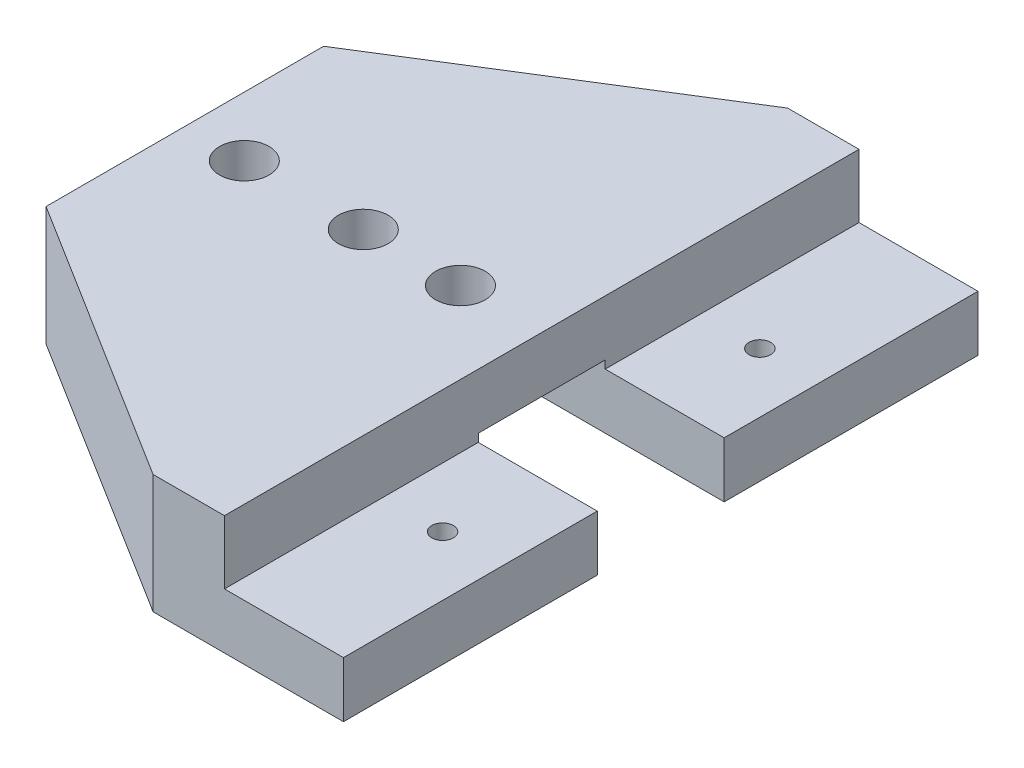
ISO-10303-21;
HEADER;
FILE_DESCRIPTION(('STEP AP214'),'2;1');
FILE_NAME('part.step','',(''),(''),'','','');
FILE_SCHEMA(('AUTOMOTIVE_DESIGN { 1 0 10303 214 1 1 1 1 }'));
ENDSEC;
DATA;
#1=APPLICATION_CONTEXT('core data for automotive mechanical design processes');
#2=APPLICATION_PROTOCOL_DEFINITION('international standard','automotive_design',2000,#1);
#3=PRODUCT_CONTEXT('',#1,'mechanical');
#4=PRODUCT('Part','Part','',(#3));
#5=PRODUCT_RELATED_PRODUCT_CATEGORY('part','',(#4));
#6=PRODUCT_DEFINITION_FORMATION('','',#4);
#7=PRODUCT_DEFINITION_CONTEXT('part definition',#1,'design');
#8=PRODUCT_DEFINITION('design','',#6,#7);
#9=PRODUCT_DEFINITION_SHAPE('','',#8);
#10=(LENGTH_UNIT() NAMED_UNIT(*) SI_UNIT(.MILLI.,.METRE.));
#11=(NAMED_UNIT(*) PLANE_ANGLE_UNIT() SI_UNIT($,.RADIAN.));
#12=(NAMED_UNIT(*) SI_UNIT($,.STERADIAN.) SOLID_ANGLE_UNIT());
#13=UNCERTAINTY_MEASURE_WITH_UNIT(LENGTH_MEASURE(1.E-05),#10,'distance_accuracy_value','');
#14=(GEOMETRIC_REPRESENTATION_CONTEXT(3) GLOBAL_UNCERTAINTY_ASSIGNED_CONTEXT((#13)) GLOBAL_UNIT_ASSIGNED_CONTEXT((#10,
#11,#12)) REPRESENTATION_CONTEXT('',''));
#15=CARTESIAN_POINT('',(0.,0.,0.));
#16=DIRECTION('',(0.,0.,1.));
#17=DIRECTION('',(1.,0.,0.));
#18=AXIS2_PLACEMENT_3D('',#15,#16,#17);
#19=CARTESIAN_POINT('',(-15.24,9.525,50.8));
#20=DIRECTION('',(0.,0.,-1.));
#21=DIRECTION('',(-1.,0.,0.));
#22=AXIS2_PLACEMENT_3D('',#19,#20,#21);
#23=PLANE('',#22);
#24=DIRECTION('',(0.,1.,0.));
#25=VECTOR('',#24,1.);
#26=CARTESIAN_POINT('',(-3.81,-0.635,50.8));
#27=LINE('',#26,#25);
#28=CARTESIAN_POINT('',(-3.81,-0.635,50.8));
#29=VERTEX_POINT('',#28);
#30=CARTESIAN_POINT('',(-3.81,9.525,50.8));
#31=VERTEX_POINT('',#30);
#32=EDGE_CURVE('E158',#29,#31,#27,.T.);
#33=ORIENTED_EDGE('',*,*,#32,.T.);
#34=DIRECTION('',(1.,0.,0.));
#35=VECTOR('',#34,1.);
#36=CARTESIAN_POINT('',(-15.24,9.525,50.8));
#37=LINE('',#36,#35);
#38=CARTESIAN_POINT('',(-15.24,9.525,50.8));
#39=VERTEX_POINT('',#38);
#40=EDGE_CURVE('E227',#39,#31,#37,.T.);
#41=ORIENTED_EDGE('',*,*,#40,.F.);
#42=DIRECTION('',(0.,-1.,0.));
#43=VECTOR('',#42,1.);
#44=CARTESIAN_POINT('',(-15.24,9.525,50.8));
#45=LINE('',#44,#43);
#46=CARTESIAN_POINT('',(-15.24,-9.525,50.8));
#47=VERTEX_POINT('',#46);
#48=EDGE_CURVE('E243',#39,#47,#45,.T.);
#49=ORIENTED_EDGE('',*,*,#48,.T.);
#50=DIRECTION('',(1.,0.,0.));
#51=VECTOR('',#50,1.);
#52=CARTESIAN_POINT('',(-15.24,-9.525,50.8));
#53=LINE('',#52,#51);
#54=CARTESIAN_POINT('',(15.24,-9.525,50.8));
#55=VERTEX_POINT('',#54);
#56=EDGE_CURVE('E218',#47,#55,#53,.T.);
#57=ORIENTED_EDGE('',*,*,#56,.T.);
#58=DIRECTION('',(0.,-1.,0.));
#59=VECTOR('',#58,1.);
#60=CARTESIAN_POINT('',(15.24,9.525,50.8));
#61=LINE('',#60,#59);
#62=CARTESIAN_POINT('',(15.24,-0.635,50.8));
#63=VERTEX_POINT('',#62);
#64=EDGE_CURVE('E171',#63,#55,#61,.T.);
#65=ORIENTED_EDGE('',*,*,#64,.F.);
#66=DIRECTION('',(-1.,0.,0.));
#67=VECTOR('',#66,1.);
#68=CARTESIAN_POINT('',(15.24,-0.635,50.8));
#69=LINE('',#68,#67);
#70=EDGE_CURVE('E149',#63,#29,#69,.T.);
#71=ORIENTED_EDGE('',*,*,#70,.T.);
#72=EDGE_LOOP('',(#33,#41,#49,#57,#65,#71));
#73=FACE_BOUND('',#72,.T.);
#74=ADVANCED_FACE('F42',(#73),#23,.F.);
#75=CARTESIAN_POINT('',(15.24,9.525,50.8));
#76=DIRECTION('',(-1.,0.,0.));
#77=DIRECTION('',(0.,0.,1.));
#78=AXIS2_PLACEMENT_3D('',#75,#76,#77);
#79=PLANE('',#78);
#80=DIRECTION('',(0.,-1.,0.));
#81=VECTOR('',#80,1.);
#82=CARTESIAN_POINT('',(15.24,9.525,-50.8));
#83=LINE('',#82,#81);
#84=CARTESIAN_POINT('',(15.24,-0.635,-50.8));
#85=VERTEX_POINT('',#84);
#86=CARTESIAN_POINT('',(15.24,-9.525,-50.8));
#87=VERTEX_POINT('',#86);
#88=EDGE_CURVE('E279',#85,#87,#83,.T.);
#89=ORIENTED_EDGE('',*,*,#88,.F.);
#90=DIRECTION('',(0.,0.,-1.));
#91=VECTOR('',#90,1.);
#92=CARTESIAN_POINT('',(15.24,-0.635,50.8));
#93=LINE('',#92,#91);
#94=CARTESIAN_POINT('',(15.24,-0.635,-10.16));
#95=VERTEX_POINT('',#94);
#96=EDGE_CURVE('E185',#95,#85,#93,.T.);
#97=ORIENTED_EDGE('',*,*,#96,.F.);
#98=DIRECTION('',(0.,-1.,0.));
#99=VECTOR('',#98,1.);
#100=CARTESIAN_POINT('',(15.24,0.635,-10.16));
#101=LINE('',#100,#99);
#102=CARTESIAN_POINT('',(15.24,-9.525,-10.16));
#103=VERTEX_POINT('',#102);
#104=EDGE_CURVE('E222',#95,#103,#101,.T.);
#105=ORIENTED_EDGE('',*,*,#104,.T.);
#106=DIRECTION('',(0.,0.,-1.));
#107=VECTOR('',#106,1.);
#108=CARTESIAN_POINT('',(15.24,-9.525,50.8));
#109=LINE('',#108,#107);
#110=EDGE_CURVE('E246',#103,#87,#109,.T.);
#111=ORIENTED_EDGE('',*,*,#110,.T.);
#112=EDGE_LOOP('',(#89,#97,#105,#111));
#113=FACE_BOUND('',#112,.T.);
#114=ADVANCED_FACE('F358',(#113),#79,.F.);
#115=CARTESIAN_POINT('',(15.24,9.525,-50.8));
#116=DIRECTION('',(0.,0.,1.));
#117=DIRECTION('',(1.,0.,0.));
#118=AXIS2_PLACEMENT_3D('',#115,#116,#117);
#119=PLANE('',#118);
#120=DIRECTION('',(0.,1.,0.));
#121=VECTOR('',#120,1.);
#122=CARTESIAN_POINT('',(-3.81,-0.635,-50.8));
#123=LINE('',#122,#121);
#124=CARTESIAN_POINT('',(-3.81,-0.635,-50.8));
#125=VERTEX_POINT('',#124);
#126=CARTESIAN_POINT('',(-3.81,9.525,-50.8));
#127=VERTEX_POINT('',#126);
#128=EDGE_CURVE('E167',#125,#127,#123,.T.);
#129=ORIENTED_EDGE('',*,*,#128,.F.);
#130=DIRECTION('',(-1.,0.,0.));
#131=VECTOR('',#130,1.);
#132=CARTESIAN_POINT('',(15.24,-0.635,-50.8));
#133=LINE('',#132,#131);
#134=EDGE_CURVE('E154',#85,#125,#133,.T.);
#135=ORIENTED_EDGE('',*,*,#134,.F.);
#136=ORIENTED_EDGE('',*,*,#88,.T.);
#137=DIRECTION('',(-1.,0.,0.));
#138=VECTOR('',#137,1.);
#139=CARTESIAN_POINT('',(15.24,-9.525,-50.8));
#140=LINE('',#139,#138);
#141=CARTESIAN_POINT('',(-15.24,-9.525,-50.8));
#142=VERTEX_POINT('',#141);
#143=EDGE_CURVE('E251',#87,#142,#140,.T.);
#144=ORIENTED_EDGE('',*,*,#143,.T.);
#145=DIRECTION('',(0.,-1.,0.));
#146=VECTOR('',#145,1.);
#147=CARTESIAN_POINT('',(-15.24,9.525,-50.8));
#148=LINE('',#147,#146);
#149=CARTESIAN_POINT('',(-15.24,9.525,-50.8));
#150=VERTEX_POINT('',#149);
#151=EDGE_CURVE('E275',#150,#142,#148,.T.);
#152=ORIENTED_EDGE('',*,*,#151,.F.);
#153=DIRECTION('',(-1.,0.,0.));
#154=VECTOR('',#153,1.);
#155=CARTESIAN_POINT('',(15.24,9.525,-50.8));
#156=LINE('',#155,#154);
#157=EDGE_CURVE('E230',#127,#150,#156,.T.);
#158=ORIENTED_EDGE('',*,*,#157,.F.);
#159=EDGE_LOOP('',(#129,#135,#136,#144,#152,#158));
#160=FACE_BOUND('',#159,.T.);
#161=ADVANCED_FACE('F325',(#160),#119,.F.);
#162=CARTESIAN_POINT('',(0.,9.525,0.));
#163=DIRECTION('',(0.,1.,0.));
#164=DIRECTION('',(0.,0.,1.));
#165=AXIS2_PLACEMENT_3D('',#162,#163,#164);
#166=PLANE('',#165);
#167=CARTESIAN_POINT('',(-51.435,9.525,0.));
#168=DIRECTION('',(0.,1.,0.));
#169=DIRECTION('',(0.,0.,1.));
#170=AXIS2_PLACEMENT_3D('',#167,#168,#169);
#171=CIRCLE('',#170,3.96875);
#172=CARTESIAN_POINT('',(-51.435,9.525,3.96875));
#173=VERTEX_POINT('',#172);
#174=EDGE_CURVE('E292',#173,#173,#171,.T.);
#175=ORIENTED_EDGE('',*,*,#174,.F.);
#176=EDGE_LOOP('',(#175));
#177=FACE_BOUND('',#176,.T.);
#178=CARTESIAN_POINT('',(-32.385,9.525,0.));
#179=DIRECTION('',(0.,1.,0.));
#180=DIRECTION('',(0.,0.,1.));
#181=AXIS2_PLACEMENT_3D('',#178,#179,#180);
#182=CIRCLE('',#181,3.96875);
#183=CARTESIAN_POINT('',(-32.385,9.525,3.96875));
#184=VERTEX_POINT('',#183);
#185=EDGE_CURVE('E291',#184,#184,#182,.T.);
#186=ORIENTED_EDGE('',*,*,#185,.F.);
#187=EDGE_LOOP('',(#186));
#188=FACE_BOUND('',#187,.T.);
#189=CARTESIAN_POINT('',(-16.8275,9.525,0.));
#190=DIRECTION('',(0.,1.,0.));
#191=DIRECTION('',(0.,0.,1.));
#192=AXIS2_PLACEMENT_3D('',#189,#190,#191);
#193=CIRCLE('',#192,3.96875);
#194=CARTESIAN_POINT('',(-16.8275,9.525,3.96875));
#195=VERTEX_POINT('',#194);
#196=EDGE_CURVE('E179',#195,#195,#193,.T.);
#197=ORIENTED_EDGE('',*,*,#196,.F.);
#198=EDGE_LOOP('',(#197));
#199=FACE_BOUND('',#198,.T.);
#200=ORIENTED_EDGE('',*,*,#40,.T.);
#201=DIRECTION('',(0.,0.,-1.));
#202=VECTOR('',#201,1.);
#203=CARTESIAN_POINT('',(-3.81,9.525,50.8));
#204=LINE('',#203,#202);
#205=EDGE_CURVE('E161',#31,#127,#204,.T.);
#206=ORIENTED_EDGE('',*,*,#205,.T.);
#207=ORIENTED_EDGE('',*,*,#157,.T.);
#208=DIRECTION('',(-0.847998304005088,0.,0.52999894000318));
#209=VECTOR('',#208,1.);
#210=CARTESIAN_POINT('',(-15.24,9.525,-50.8));
#211=LINE('',#210,#209);
#212=CARTESIAN_POINT('',(-60.96,9.525,-22.225));
#213=VERTEX_POINT('',#212);
#214=EDGE_CURVE('E234',#150,#213,#211,.T.);
#215=ORIENTED_EDGE('',*,*,#214,.T.);
#216=DIRECTION('',(0.,0.,1.));
#217=VECTOR('',#216,1.);
#218=CARTESIAN_POINT('',(-60.96,9.525,-22.225));
#219=LINE('',#218,#217);
#220=CARTESIAN_POINT('',(-60.96,9.525,22.225));
#221=VERTEX_POINT('',#220);
#222=EDGE_CURVE('E237',#213,#221,#219,.T.);
#223=ORIENTED_EDGE('',*,*,#222,.T.);
#224=DIRECTION('',(0.847998304005088,0.,0.52999894000318));
#225=VECTOR('',#224,1.);
#226=CARTESIAN_POINT('',(-60.96,9.525,22.225));
#227=LINE('',#226,#225);
#228=EDGE_CURVE('E240',#221,#39,#227,.T.);
#229=ORIENTED_EDGE('',*,*,#228,.T.);
#230=EDGE_LOOP('',(#200,#206,#207,#215,#223,#229));
#231=FACE_BOUND('',#230,.T.);
#232=ADVANCED_FACE('F321',(#177,#188,#199,#231),#166,.T.);
#233=CARTESIAN_POINT('',(-60.96,0.635,10.16));
#234=DIRECTION('',(0.,0.,1.));
#235=DIRECTION('',(1.,0.,0.));
#236=AXIS2_PLACEMENT_3D('',#233,#234,#235);
#237=PLANE('',#236);
#238=DIRECTION('',(0.,1.,0.));
#239=VECTOR('',#238,1.);
#240=CARTESIAN_POINT('',(-3.81,0.635,10.16));
#241=LINE('',#240,#239);
#242=CARTESIAN_POINT('',(-3.81,-0.635,10.16));
#243=VERTEX_POINT('',#242);
#244=CARTESIAN_POINT('',(-3.81000000000001,0.635,10.16));
#245=VERTEX_POINT('',#244);
#246=EDGE_CURVE('E59',#243,#245,#241,.T.);
#247=ORIENTED_EDGE('',*,*,#246,.F.);
#248=DIRECTION('',(1.,0.,0.));
#249=VECTOR('',#248,1.);
#250=CARTESIAN_POINT('',(-60.96,-0.635,10.16));
#251=LINE('',#250,#249);
#252=CARTESIAN_POINT('',(15.24,-0.635,10.16));
#253=VERTEX_POINT('',#252);
#254=EDGE_CURVE('E152',#243,#253,#251,.T.);
#255=ORIENTED_EDGE('',*,*,#254,.T.);
#256=DIRECTION('',(0.,-1.,0.));
#257=VECTOR('',#256,1.);
#258=CARTESIAN_POINT('',(15.24,0.635,10.16));
#259=LINE('',#258,#257);
#260=CARTESIAN_POINT('',(15.24,-9.525,10.16));
#261=VERTEX_POINT('',#260);
#262=EDGE_CURVE('E219',#253,#261,#259,.T.);
#263=ORIENTED_EDGE('',*,*,#262,.T.);
#264=DIRECTION('',(-1.,0.,0.));
#265=VECTOR('',#264,1.);
#266=CARTESIAN_POINT('',(-60.96,-9.525,10.16));
#267=LINE('',#266,#265);
#268=CARTESIAN_POINT('',(-60.96,-9.525,10.16));
#269=VERTEX_POINT('',#268);
#270=EDGE_CURVE('E203',#261,#269,#267,.T.);
#271=ORIENTED_EDGE('',*,*,#270,.T.);
#272=DIRECTION('',(0.,-1.,0.));
#273=VECTOR('',#272,1.);
#274=CARTESIAN_POINT('',(-60.96,0.635,10.16));
#275=LINE('',#274,#273);
#276=CARTESIAN_POINT('',(-60.96,0.635,10.16));
#277=VERTEX_POINT('',#276);
#278=EDGE_CURVE('E214',#277,#269,#275,.T.);
#279=ORIENTED_EDGE('',*,*,#278,.F.);
#280=DIRECTION('',(-1.,0.,0.));
#281=VECTOR('',#280,1.);
#282=CARTESIAN_POINT('',(-60.96,0.635,10.16));
#283=LINE('',#282,#281);
#284=EDGE_CURVE('E207',#245,#277,#283,.T.);
#285=ORIENTED_EDGE('',*,*,#284,.F.);
#286=EDGE_LOOP('',(#247,#255,#263,#271,#279,#285));
#287=FACE_BOUND('',#286,.T.);
#288=ADVANCED_FACE('F324',(#287),#237,.F.);
#289=CARTESIAN_POINT('',(-60.96,0.635,-10.16));
#290=DIRECTION('',(0.,0.,-1.));
#291=DIRECTION('',(-1.,0.,0.));
#292=AXIS2_PLACEMENT_3D('',#289,#290,#291);
#293=PLANE('',#292);
#294=DIRECTION('',(0.,-1.,0.));
#295=VECTOR('',#294,1.);
#296=CARTESIAN_POINT('',(-3.81,0.635,-10.16));
#297=LINE('',#296,#295);
#298=CARTESIAN_POINT('',(-3.81,0.635,-10.16));
#299=VERTEX_POINT('',#298);
#300=CARTESIAN_POINT('',(-3.81,-0.635,-10.16));
#301=VERTEX_POINT('',#300);
#302=EDGE_CURVE('E166',#299,#301,#297,.T.);
#303=ORIENTED_EDGE('',*,*,#302,.F.);
#304=DIRECTION('',(1.,0.,0.));
#305=VECTOR('',#304,1.);
#306=CARTESIAN_POINT('',(-60.96,0.635,-10.16));
#307=LINE('',#306,#305);
#308=CARTESIAN_POINT('',(-60.96,0.635,-10.16));
#309=VERTEX_POINT('',#308);
#310=EDGE_CURVE('E202',#309,#299,#307,.T.);
#311=ORIENTED_EDGE('',*,*,#310,.F.);
#312=DIRECTION('',(0.,-1.,0.));
#313=VECTOR('',#312,1.);
#314=CARTESIAN_POINT('',(-60.96,0.635,-10.16));
#315=LINE('',#314,#313);
#316=CARTESIAN_POINT('',(-60.96,-9.525,-10.16));
#317=VERTEX_POINT('',#316);
#318=EDGE_CURVE('E67',#309,#317,#315,.T.);
#319=ORIENTED_EDGE('',*,*,#318,.T.);
#320=DIRECTION('',(1.,0.,0.));
#321=VECTOR('',#320,1.);
#322=CARTESIAN_POINT('',(-60.96,-9.525,-10.16));
#323=LINE('',#322,#321);
#324=EDGE_CURVE('E197',#317,#103,#323,.T.);
#325=ORIENTED_EDGE('',*,*,#324,.T.);
#326=ORIENTED_EDGE('',*,*,#104,.F.);
#327=DIRECTION('',(-1.,0.,0.));
#328=VECTOR('',#327,1.);
#329=CARTESIAN_POINT('',(-60.96,-0.635,-10.16));
#330=LINE('',#329,#328);
#331=EDGE_CURVE('E11',#95,#301,#330,.T.);
#332=ORIENTED_EDGE('',*,*,#331,.T.);
#333=EDGE_LOOP('',(#303,#311,#319,#325,#326,#332));
#334=FACE_BOUND('',#333,.T.);
#335=ADVANCED_FACE('F350',(#334),#293,.F.);
#336=CARTESIAN_POINT('',(0.,0.635,0.));
#337=DIRECTION('',(0.,1.,0.));
#338=DIRECTION('',(0.,0.,1.));
#339=AXIS2_PLACEMENT_3D('',#336,#337,#338);
#340=PLANE('',#339);
#341=CARTESIAN_POINT('',(-51.435,0.635,0.));
#342=DIRECTION('',(0.,1.,0.));
#343=DIRECTION('',(0.,0.,1.));
#344=AXIS2_PLACEMENT_3D('',#341,#342,#343);
#345=CIRCLE('',#344,3.96875);
#346=CARTESIAN_POINT('',(-51.435,0.635,3.96875));
#347=VERTEX_POINT('',#346);
#348=EDGE_CURVE('E288',#347,#347,#345,.T.);
#349=ORIENTED_EDGE('',*,*,#348,.T.);
#350=EDGE_LOOP('',(#349));
#351=FACE_BOUND('',#350,.T.);
#352=CARTESIAN_POINT('',(-32.385,0.635,0.));
#353=DIRECTION('',(0.,1.,0.));
#354=DIRECTION('',(0.,0.,1.));
#355=AXIS2_PLACEMENT_3D('',#352,#353,#354);
#356=CIRCLE('',#355,3.96875);
#357=CARTESIAN_POINT('',(-32.385,0.635,3.96875));
#358=VERTEX_POINT('',#357);
#359=EDGE_CURVE('E298',#358,#358,#356,.T.);
#360=ORIENTED_EDGE('',*,*,#359,.T.);
#361=EDGE_LOOP('',(#360));
#362=FACE_BOUND('',#361,.T.);
#363=CARTESIAN_POINT('',(-16.8275,0.635,0.));
#364=DIRECTION('',(0.,1.,0.));
#365=DIRECTION('',(0.,0.,1.));
#366=AXIS2_PLACEMENT_3D('',#363,#364,#365);
#367=CIRCLE('',#366,3.96875);
#368=CARTESIAN_POINT('',(-16.8275,0.635,3.96875));
#369=VERTEX_POINT('',#368);
#370=EDGE_CURVE('E176',#369,#369,#367,.T.);
#371=ORIENTED_EDGE('',*,*,#370,.T.);
#372=EDGE_LOOP('',(#371));
#373=FACE_BOUND('',#372,.T.);
#374=DIRECTION('',(0.,0.,-1.));
#375=VECTOR('',#374,1.);
#376=CARTESIAN_POINT('',(-3.81,0.635,0.));
#377=LINE('',#376,#375);
#378=EDGE_CURVE('E51',#245,#299,#377,.T.);
#379=ORIENTED_EDGE('',*,*,#378,.F.);
#380=ORIENTED_EDGE('',*,*,#284,.T.);
#381=DIRECTION('',(0.,0.,-1.));
#382=VECTOR('',#381,1.);
#383=CARTESIAN_POINT('',(-60.96,0.635,-10.16));
#384=LINE('',#383,#382);
#385=EDGE_CURVE('E198',#277,#309,#384,.T.);
#386=ORIENTED_EDGE('',*,*,#385,.T.);
#387=ORIENTED_EDGE('',*,*,#310,.T.);
#388=EDGE_LOOP('',(#379,#380,#386,#387));
#389=FACE_BOUND('',#388,.T.);
#390=ADVANCED_FACE('F347',(#351,#362,#373,#389),#340,.F.);
#391=CARTESIAN_POINT('',(0.,-9.525,0.));
#392=DIRECTION('',(0.,1.,0.));
#393=DIRECTION('',(0.,0.,1.));
#394=AXIS2_PLACEMENT_3D('',#391,#392,#393);
#395=PLANE('',#394);
#396=CARTESIAN_POINT('',(5.71500000000001,-9.525,25.4));
#397=DIRECTION('',(0.,-1.,0.));
#398=DIRECTION('',(0.,0.,-1.));
#399=AXIS2_PLACEMENT_3D('',#396,#397,#398);
#400=CIRCLE('',#399,1.7272);
#401=CARTESIAN_POINT('',(5.71500000000001,-9.525,23.6728));
#402=VERTEX_POINT('',#401);
#403=EDGE_CURVE('E434',#402,#402,#400,.T.);
#404=ORIENTED_EDGE('',*,*,#403,.F.);
#405=EDGE_LOOP('',(#404));
#406=FACE_BOUND('',#405,.T.);
#407=DIRECTION('',(0.,0.,1.));
#408=VECTOR('',#407,1.);
#409=CARTESIAN_POINT('',(-60.96,-9.525,-22.225));
#410=LINE('',#409,#408);
#411=CARTESIAN_POINT('',(-60.96,-9.525,22.225));
#412=VERTEX_POINT('',#411);
#413=EDGE_CURVE('E257',#269,#412,#410,.T.);
#414=ORIENTED_EDGE('',*,*,#413,.F.);
#415=ORIENTED_EDGE('',*,*,#270,.F.);
#416=EDGE_CURVE('E247',#55,#261,#109,.T.);
#417=ORIENTED_EDGE('',*,*,#416,.F.);
#418=ORIENTED_EDGE('',*,*,#56,.F.);
#419=DIRECTION('',(0.847998304005088,0.,0.52999894000318));
#420=VECTOR('',#419,1.);
#421=CARTESIAN_POINT('',(-60.96,-9.525,22.225));
#422=LINE('',#421,#420);
#423=EDGE_CURVE('E231',#412,#47,#422,.T.);
#424=ORIENTED_EDGE('',*,*,#423,.F.);
#425=EDGE_LOOP('',(#414,#415,#417,#418,#424));
#426=FACE_BOUND('',#425,.T.);
#427=ADVANCED_FACE('F337',(#406,#426),#395,.F.);
#428=ORIENTED_EDGE('',*,*,#262,.F.);
#429=EDGE_CURVE('E186',#63,#253,#93,.T.);
#430=ORIENTED_EDGE('',*,*,#429,.F.);
#431=ORIENTED_EDGE('',*,*,#64,.T.);
#432=ORIENTED_EDGE('',*,*,#416,.T.);
#433=EDGE_LOOP('',(#428,#430,#431,#432));
#434=FACE_BOUND('',#433,.T.);
#435=ADVANCED_FACE('F341',(#434),#79,.F.);
#436=CARTESIAN_POINT('',(-15.24,9.525,-50.8));
#437=DIRECTION('',(0.52999894000318,0.,0.847998304005088));
#438=DIRECTION('',(0.847998304005088,0.,-0.52999894000318));
#439=AXIS2_PLACEMENT_3D('',#436,#437,#438);
#440=PLANE('',#439);
#441=DIRECTION('',(-0.847998304005088,0.,0.52999894000318));
#442=VECTOR('',#441,1.);
#443=CARTESIAN_POINT('',(-15.24,-9.525,-50.8));
#444=LINE('',#443,#442);
#445=CARTESIAN_POINT('',(-60.96,-9.525,-22.225));
#446=VERTEX_POINT('',#445);
#447=EDGE_CURVE('E254',#142,#446,#444,.T.);
#448=ORIENTED_EDGE('',*,*,#447,.T.);
#449=DIRECTION('',(0.,-1.,0.));
#450=VECTOR('',#449,1.);
#451=CARTESIAN_POINT('',(-60.96,9.525,-22.225));
#452=LINE('',#451,#450);
#453=EDGE_CURVE('E271',#213,#446,#452,.T.);
#454=ORIENTED_EDGE('',*,*,#453,.F.);
#455=ORIENTED_EDGE('',*,*,#214,.F.);
#456=ORIENTED_EDGE('',*,*,#151,.T.);
#457=EDGE_LOOP('',(#448,#454,#455,#456));
#458=FACE_BOUND('',#457,.T.);
#459=ADVANCED_FACE('F378',(#458),#440,.F.);
#460=CARTESIAN_POINT('',(-60.96,9.525,-22.225));
#461=DIRECTION('',(1.,0.,0.));
#462=DIRECTION('',(0.,0.,-1.));
#463=AXIS2_PLACEMENT_3D('',#460,#461,#462);
#464=PLANE('',#463);
#465=ORIENTED_EDGE('',*,*,#385,.F.);
#466=ORIENTED_EDGE('',*,*,#278,.T.);
#467=ORIENTED_EDGE('',*,*,#413,.T.);
#468=DIRECTION('',(0.,-1.,0.));
#469=VECTOR('',#468,1.);
#470=CARTESIAN_POINT('',(-60.96,9.525,22.225));
#471=LINE('',#470,#469);
#472=EDGE_CURVE('E267',#221,#412,#471,.T.);
#473=ORIENTED_EDGE('',*,*,#472,.F.);
#474=ORIENTED_EDGE('',*,*,#222,.F.);
#475=ORIENTED_EDGE('',*,*,#453,.T.);
#476=EDGE_CURVE('E258',#446,#317,#410,.T.);
#477=ORIENTED_EDGE('',*,*,#476,.T.);
#478=ORIENTED_EDGE('',*,*,#318,.F.);
#479=EDGE_LOOP('',(#465,#466,#467,#473,#474,#475,#477,#478));
#480=FACE_BOUND('',#479,.T.);
#481=ADVANCED_FACE('F365',(#480),#464,.F.);
#482=CARTESIAN_POINT('',(-60.96,9.525,22.225));
#483=DIRECTION('',(0.52999894000318,0.,-0.847998304005088));
#484=DIRECTION('',(-0.847998304005088,0.,-0.52999894000318));
#485=AXIS2_PLACEMENT_3D('',#482,#483,#484);
#486=PLANE('',#485);
#487=ORIENTED_EDGE('',*,*,#423,.T.);
#488=ORIENTED_EDGE('',*,*,#48,.F.);
#489=ORIENTED_EDGE('',*,*,#228,.F.);
#490=ORIENTED_EDGE('',*,*,#472,.T.);
#491=EDGE_LOOP('',(#487,#488,#489,#490));
#492=FACE_BOUND('',#491,.T.);
#493=ADVANCED_FACE('F367',(#492),#486,.F.);
#494=CARTESIAN_POINT('',(5.71500000000001,-9.525,-25.4));
#495=DIRECTION('',(0.,-1.,0.));
#496=DIRECTION('',(0.,0.,-1.));
#497=AXIS2_PLACEMENT_3D('',#494,#495,#496);
#498=CIRCLE('',#497,1.7272);
#499=CARTESIAN_POINT('',(5.71500000000001,-9.525,-27.1272));
#500=VERTEX_POINT('',#499);
#501=EDGE_CURVE('E307',#500,#500,#498,.T.);
#502=ORIENTED_EDGE('',*,*,#501,.F.);
#503=EDGE_LOOP('',(#502));
#504=FACE_BOUND('',#503,.T.);
#505=ORIENTED_EDGE('',*,*,#110,.F.);
#506=ORIENTED_EDGE('',*,*,#324,.F.);
#507=ORIENTED_EDGE('',*,*,#476,.F.);
#508=ORIENTED_EDGE('',*,*,#447,.F.);
#509=ORIENTED_EDGE('',*,*,#143,.F.);
#510=EDGE_LOOP('',(#505,#506,#507,#508,#509));
#511=FACE_BOUND('',#510,.T.);
#512=ADVANCED_FACE('F369',(#504,#511),#395,.F.);
#513=CARTESIAN_POINT('',(0.,-0.635,0.));
#514=DIRECTION('',(0.,-1.,0.));
#515=DIRECTION('',(0.,0.,-1.));
#516=AXIS2_PLACEMENT_3D('',#513,#514,#515);
#517=PLANE('',#516);
#518=CARTESIAN_POINT('',(5.71500000000001,-0.635,25.4));
#519=DIRECTION('',(0.,-1.,0.));
#520=DIRECTION('',(0.,0.,-1.));
#521=AXIS2_PLACEMENT_3D('',#518,#519,#520);
#522=CIRCLE('',#521,1.7272);
#523=CARTESIAN_POINT('',(5.71500000000001,-0.635,23.6728));
#524=VERTEX_POINT('',#523);
#525=EDGE_CURVE('E45',#524,#524,#522,.T.);
#526=ORIENTED_EDGE('',*,*,#525,.T.);
#527=EDGE_LOOP('',(#526));
#528=FACE_BOUND('',#527,.T.);
#529=DIRECTION('',(0.,0.,-1.));
#530=VECTOR('',#529,1.);
#531=CARTESIAN_POINT('',(-3.81,-0.635,50.8));
#532=LINE('',#531,#530);
#533=EDGE_CURVE('E145',#29,#243,#532,.T.);
#534=ORIENTED_EDGE('',*,*,#533,.F.);
#535=ORIENTED_EDGE('',*,*,#70,.F.);
#536=ORIENTED_EDGE('',*,*,#429,.T.);
#537=ORIENTED_EDGE('',*,*,#254,.F.);
#538=EDGE_LOOP('',(#534,#535,#536,#537));
#539=FACE_BOUND('',#538,.T.);
#540=ADVANCED_FACE('F147',(#528,#539),#517,.F.);
#541=CARTESIAN_POINT('',(5.71500000000001,-0.635,-25.4));
#542=DIRECTION('',(0.,-1.,0.));
#543=DIRECTION('',(0.,0.,-1.));
#544=AXIS2_PLACEMENT_3D('',#541,#542,#543);
#545=CIRCLE('',#544,1.7272);
#546=CARTESIAN_POINT('',(5.71500000000001,-0.635,-27.1272));
#547=VERTEX_POINT('',#546);
#548=EDGE_CURVE('E301',#547,#547,#545,.T.);
#549=ORIENTED_EDGE('',*,*,#548,.T.);
#550=EDGE_LOOP('',(#549));
#551=FACE_BOUND('',#550,.T.);
#552=ORIENTED_EDGE('',*,*,#96,.T.);
#553=ORIENTED_EDGE('',*,*,#134,.T.);
#554=EDGE_CURVE('E155',#301,#125,#532,.T.);
#555=ORIENTED_EDGE('',*,*,#554,.F.);
#556=ORIENTED_EDGE('',*,*,#331,.F.);
#557=EDGE_LOOP('',(#552,#553,#555,#556));
#558=FACE_BOUND('',#557,.T.);
#559=ADVANCED_FACE('F354',(#551,#558),#517,.F.);
#560=CARTESIAN_POINT('',(-3.81,-0.635,50.8));
#561=DIRECTION('',(1.,0.,0.));
#562=DIRECTION('',(0.,0.,-1.));
#563=AXIS2_PLACEMENT_3D('',#560,#561,#562);
#564=PLANE('',#563);
#565=ORIENTED_EDGE('',*,*,#246,.T.);
#566=ORIENTED_EDGE('',*,*,#378,.T.);
#567=ORIENTED_EDGE('',*,*,#302,.T.);
#568=ORIENTED_EDGE('',*,*,#554,.T.);
#569=ORIENTED_EDGE('',*,*,#128,.T.);
#570=ORIENTED_EDGE('',*,*,#205,.F.);
#571=ORIENTED_EDGE('',*,*,#32,.F.);
#572=ORIENTED_EDGE('',*,*,#533,.T.);
#573=EDGE_LOOP('',(#565,#566,#567,#568,#569,#570,#571,#572));
#574=FACE_BOUND('',#573,.T.);
#575=ADVANCED_FACE('F159',(#574),#564,.T.);
#576=CARTESIAN_POINT('',(-16.8275,9.525,0.));
#577=DIRECTION('',(0.,1.,0.));
#578=DIRECTION('',(0.,0.,1.));
#579=AXIS2_PLACEMENT_3D('',#576,#577,#578);
#580=CYLINDRICAL_SURFACE('',#579,3.96875);
#581=ORIENTED_EDGE('',*,*,#196,.T.);
#582=EDGE_LOOP('',(#581));
#583=FACE_BOUND('',#582,.T.);
#584=ORIENTED_EDGE('',*,*,#370,.F.);
#585=EDGE_LOOP('',(#584));
#586=FACE_BOUND('',#585,.T.);
#587=ADVANCED_FACE('F318',(#583,#586),#580,.F.);
#588=CARTESIAN_POINT('',(-32.385,9.525,0.));
#589=DIRECTION('',(0.,1.,0.));
#590=DIRECTION('',(0.,0.,1.));
#591=AXIS2_PLACEMENT_3D('',#588,#589,#590);
#592=CYLINDRICAL_SURFACE('',#591,3.96875);
#593=ORIENTED_EDGE('',*,*,#185,.T.);
#594=EDGE_LOOP('',(#593));
#595=FACE_BOUND('',#594,.T.);
#596=ORIENTED_EDGE('',*,*,#359,.F.);
#597=EDGE_LOOP('',(#596));
#598=FACE_BOUND('',#597,.T.);
#599=ADVANCED_FACE('F417',(#595,#598),#592,.F.);
#600=CARTESIAN_POINT('',(-51.435,9.525,0.));
#601=DIRECTION('',(0.,1.,0.));
#602=DIRECTION('',(0.,0.,1.));
#603=AXIS2_PLACEMENT_3D('',#600,#601,#602);
#604=CYLINDRICAL_SURFACE('',#603,3.96875);
#605=ORIENTED_EDGE('',*,*,#174,.T.);
#606=EDGE_LOOP('',(#605));
#607=FACE_BOUND('',#606,.T.);
#608=ORIENTED_EDGE('',*,*,#348,.F.);
#609=EDGE_LOOP('',(#608));
#610=FACE_BOUND('',#609,.T.);
#611=ADVANCED_FACE('F420',(#607,#610),#604,.F.);
#612=CARTESIAN_POINT('',(5.71500000000001,-9.525,-25.4));
#613=DIRECTION('',(0.,-1.,0.));
#614=DIRECTION('',(0.,0.,-1.));
#615=AXIS2_PLACEMENT_3D('',#612,#613,#614);
#616=CYLINDRICAL_SURFACE('',#615,1.7272);
#617=ORIENTED_EDGE('',*,*,#501,.T.);
#618=EDGE_LOOP('',(#617));
#619=FACE_BOUND('',#618,.T.);
#620=ORIENTED_EDGE('',*,*,#548,.F.);
#621=EDGE_LOOP('',(#620));
#622=FACE_BOUND('',#621,.T.);
#623=ADVANCED_FACE('F424',(#619,#622),#616,.F.);
#624=CARTESIAN_POINT('',(5.71500000000001,-9.525,25.4));
#625=DIRECTION('',(0.,-1.,0.));
#626=DIRECTION('',(0.,0.,-1.));
#627=AXIS2_PLACEMENT_3D('',#624,#625,#626);
#628=CYLINDRICAL_SURFACE('',#627,1.7272);
#629=ORIENTED_EDGE('',*,*,#403,.T.);
#630=EDGE_LOOP('',(#629));
#631=FACE_BOUND('',#630,.T.);
#632=ORIENTED_EDGE('',*,*,#525,.F.);
#633=EDGE_LOOP('',(#632));
#634=FACE_BOUND('',#633,.T.);
#635=ADVANCED_FACE('F427',(#631,#634),#628,.F.);
#636=CLOSED_SHELL('',(#74,#114,#161,#232,#288,#335,#390,#427,#435,#459,#481,#493,#512,#540,#559,
#575,#587,#599,#611,#623,#635));
#637=MANIFOLD_SOLID_BREP('B2',#636);
#638=ADVANCED_BREP_SHAPE_REPRESENTATION('',(#18,#637),#14);
#639=SHAPE_DEFINITION_REPRESENTATION(#9,#638);
ENDSEC;
END-ISO-10303-21;
